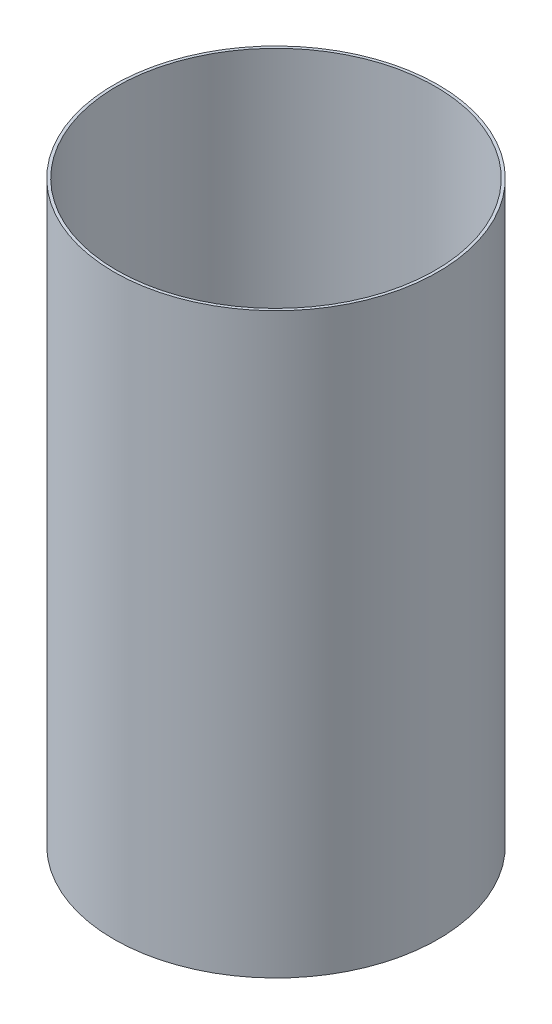
ISO-10303-21;
HEADER;
FILE_DESCRIPTION(('STEP AP214'),'2;1');
FILE_NAME('part.step','',(''),(''),'','','');
FILE_SCHEMA(('AUTOMOTIVE_DESIGN { 1 0 10303 214 1 1 1 1 }'));
ENDSEC;
DATA;
#1=APPLICATION_CONTEXT('core data for automotive mechanical design processes');
#2=APPLICATION_PROTOCOL_DEFINITION('international standard','automotive_design',2000,#1);
#3=PRODUCT_CONTEXT('',#1,'mechanical');
#4=PRODUCT('Part','Part','',(#3));
#5=PRODUCT_RELATED_PRODUCT_CATEGORY('part','',(#4));
#6=PRODUCT_DEFINITION_FORMATION('','',#4);
#7=PRODUCT_DEFINITION_CONTEXT('part definition',#1,'design');
#8=PRODUCT_DEFINITION('design','',#6,#7);
#9=PRODUCT_DEFINITION_SHAPE('','',#8);
#10=(LENGTH_UNIT() NAMED_UNIT(*) SI_UNIT(.MILLI.,.METRE.));
#11=(NAMED_UNIT(*) PLANE_ANGLE_UNIT() SI_UNIT($,.RADIAN.));
#12=(NAMED_UNIT(*) SI_UNIT($,.STERADIAN.) SOLID_ANGLE_UNIT());
#13=UNCERTAINTY_MEASURE_WITH_UNIT(LENGTH_MEASURE(1.E-05),#10,'distance_accuracy_value','');
#14=(GEOMETRIC_REPRESENTATION_CONTEXT(3) GLOBAL_UNCERTAINTY_ASSIGNED_CONTEXT((#13)) GLOBAL_UNIT_ASSIGNED_CONTEXT((#10,
#11,#12)) REPRESENTATION_CONTEXT('',''));
#15=CARTESIAN_POINT('',(0.,0.,0.));
#16=DIRECTION('',(0.,0.,1.));
#17=DIRECTION('',(1.,0.,0.));
#18=AXIS2_PLACEMENT_3D('',#15,#16,#17);
#19=CARTESIAN_POINT('',(0.,228.6,0.));
#20=DIRECTION('',(0.,1.,0.));
#21=DIRECTION('',(0.,0.,1.));
#22=AXIS2_PLACEMENT_3D('',#19,#20,#21);
#23=PLANE('',#22);
#24=CARTESIAN_POINT('',(0.,228.6,0.));
#25=DIRECTION('',(0.,1.,0.));
#26=DIRECTION('',(0.,0.,1.));
#27=AXIS2_PLACEMENT_3D('',#24,#25,#26);
#28=CIRCLE('',#27,64.135);
#29=CARTESIAN_POINT('',(0.,228.6,64.135));
#30=VERTEX_POINT('',#29);
#31=EDGE_CURVE('E10',#30,#30,#28,.T.);
#32=ORIENTED_EDGE('',*,*,#31,.T.);
#33=EDGE_LOOP('',(#32));
#34=FACE_BOUND('',#33,.T.);
#35=CARTESIAN_POINT('',(0.,228.6,0.));
#36=DIRECTION('',(0.,1.,0.));
#37=DIRECTION('',(0.,0.,1.));
#38=AXIS2_PLACEMENT_3D('',#35,#36,#37);
#39=CIRCLE('',#38,63.0174);
#40=CARTESIAN_POINT('',(0.,228.6,63.0174));
#41=VERTEX_POINT('',#40);
#42=EDGE_CURVE('E42',#41,#41,#39,.T.);
#43=ORIENTED_EDGE('',*,*,#42,.F.);
#44=EDGE_LOOP('',(#43));
#45=FACE_BOUND('',#44,.T.);
#46=ADVANCED_FACE('F31',(#34,#45),#23,.T.);
#47=CARTESIAN_POINT('',(0.,0.,0.));
#48=DIRECTION('',(0.,1.,0.));
#49=DIRECTION('',(0.,0.,1.));
#50=AXIS2_PLACEMENT_3D('',#47,#48,#49);
#51=PLANE('',#50);
#52=CARTESIAN_POINT('',(0.,0.,0.));
#53=DIRECTION('',(0.,1.,0.));
#54=DIRECTION('',(0.,0.,1.));
#55=AXIS2_PLACEMENT_3D('',#52,#53,#54);
#56=CIRCLE('',#55,64.135);
#57=CARTESIAN_POINT('',(0.,0.,64.135));
#58=VERTEX_POINT('',#57);
#59=EDGE_CURVE('E35',#58,#58,#56,.T.);
#60=ORIENTED_EDGE('',*,*,#59,.F.);
#61=EDGE_LOOP('',(#60));
#62=FACE_BOUND('',#61,.T.);
#63=CARTESIAN_POINT('',(0.,0.,0.));
#64=DIRECTION('',(0.,1.,0.));
#65=DIRECTION('',(0.,0.,1.));
#66=AXIS2_PLACEMENT_3D('',#63,#64,#65);
#67=CIRCLE('',#66,63.0174);
#68=CARTESIAN_POINT('',(0.,0.,63.0174));
#69=VERTEX_POINT('',#68);
#70=EDGE_CURVE('E44',#69,#69,#67,.T.);
#71=ORIENTED_EDGE('',*,*,#70,.T.);
#72=EDGE_LOOP('',(#71));
#73=FACE_BOUND('',#72,.T.);
#74=ADVANCED_FACE('F54',(#62,#73),#51,.F.);
#75=CARTESIAN_POINT('',(0.,228.6,0.));
#76=DIRECTION('',(0.,-1.,0.));
#77=DIRECTION('',(0.,0.,-1.));
#78=AXIS2_PLACEMENT_3D('',#75,#76,#77);
#79=CYLINDRICAL_SURFACE('',#78,64.135);
#80=ORIENTED_EDGE('',*,*,#31,.F.);
#81=EDGE_LOOP('',(#80));
#82=FACE_BOUND('',#81,.T.);
#83=ORIENTED_EDGE('',*,*,#59,.T.);
#84=EDGE_LOOP('',(#83));
#85=FACE_BOUND('',#84,.T.);
#86=ADVANCED_FACE('F33',(#82,#85),#79,.T.);
#87=CARTESIAN_POINT('',(0.,228.6,0.));
#88=DIRECTION('',(0.,-1.,0.));
#89=DIRECTION('',(0.,0.,-1.));
#90=AXIS2_PLACEMENT_3D('',#87,#88,#89);
#91=CYLINDRICAL_SURFACE('',#90,63.0174);
#92=ORIENTED_EDGE('',*,*,#42,.T.);
#93=EDGE_LOOP('',(#92));
#94=FACE_BOUND('',#93,.T.);
#95=ORIENTED_EDGE('',*,*,#70,.F.);
#96=EDGE_LOOP('',(#95));
#97=FACE_BOUND('',#96,.T.);
#98=ADVANCED_FACE('F50',(#94,#97),#91,.F.);
#99=CLOSED_SHELL('',(#46,#74,#86,#98));
#100=MANIFOLD_SOLID_BREP('B2',#99);
#101=ADVANCED_BREP_SHAPE_REPRESENTATION('',(#18,#100),#14);
#102=SHAPE_DEFINITION_REPRESENTATION(#9,#101);
ENDSEC;
END-ISO-10303-21;
